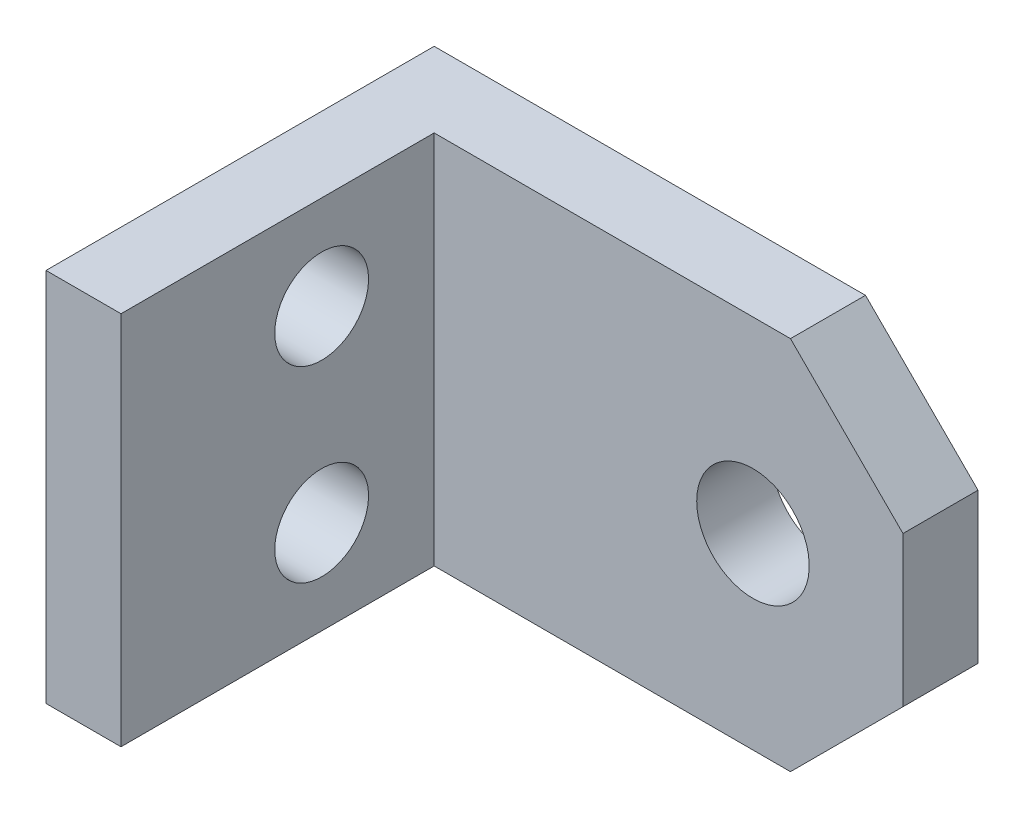
ISO-10303-21;
HEADER;
FILE_DESCRIPTION(('STEP AP214'),'2;1');
FILE_NAME('part.step','',(''),(''),'','','');
FILE_SCHEMA(('AUTOMOTIVE_DESIGN { 1 0 10303 214 1 1 1 1 }'));
ENDSEC;
DATA;
#1=APPLICATION_CONTEXT('core data for automotive mechanical design processes');
#2=APPLICATION_PROTOCOL_DEFINITION('international standard','automotive_design',2000,#1);
#3=PRODUCT_CONTEXT('',#1,'mechanical');
#4=PRODUCT('Part','Part','',(#3));
#5=PRODUCT_RELATED_PRODUCT_CATEGORY('part','',(#4));
#6=PRODUCT_DEFINITION_FORMATION('','',#4);
#7=PRODUCT_DEFINITION_CONTEXT('part definition',#1,'design');
#8=PRODUCT_DEFINITION('design','',#6,#7);
#9=PRODUCT_DEFINITION_SHAPE('','',#8);
#10=(LENGTH_UNIT() NAMED_UNIT(*) SI_UNIT(.MILLI.,.METRE.));
#11=(NAMED_UNIT(*) PLANE_ANGLE_UNIT() SI_UNIT($,.RADIAN.));
#12=(NAMED_UNIT(*) SI_UNIT($,.STERADIAN.) SOLID_ANGLE_UNIT());
#13=UNCERTAINTY_MEASURE_WITH_UNIT(LENGTH_MEASURE(1.E-05),#10,'distance_accuracy_value','');
#14=(GEOMETRIC_REPRESENTATION_CONTEXT(3) GLOBAL_UNCERTAINTY_ASSIGNED_CONTEXT((#13)) GLOBAL_UNIT_ASSIGNED_CONTEXT((#10,
#11,#12)) REPRESENTATION_CONTEXT('',''));
#15=CARTESIAN_POINT('',(0.,0.,0.));
#16=DIRECTION('',(0.,0.,1.));
#17=DIRECTION('',(1.,0.,0.));
#18=AXIS2_PLACEMENT_3D('',#15,#16,#17);
#19=CARTESIAN_POINT('',(4.,0.,0.));
#20=DIRECTION('',(-1.,0.,0.));
#21=DIRECTION('',(0.,0.,1.));
#22=AXIS2_PLACEMENT_3D('',#19,#20,#21);
#23=PLANE('',#22);
#24=CARTESIAN_POINT('',(4.,5.,-10.7));
#25=DIRECTION('',(-1.,0.,0.));
#26=DIRECTION('',(0.,0.,1.));
#27=AXIS2_PLACEMENT_3D('',#24,#25,#26);
#28=CIRCLE('',#27,2.5);
#29=CARTESIAN_POINT('',(4.,5.,-8.2));
#30=VERTEX_POINT('',#29);
#31=EDGE_CURVE('E314',#30,#30,#28,.T.);
#32=ORIENTED_EDGE('',*,*,#31,.T.);
#33=EDGE_LOOP('',(#32));
#34=FACE_BOUND('',#33,.T.);
#35=CARTESIAN_POINT('',(4.,15.,-10.7));
#36=DIRECTION('',(-1.,0.,0.));
#37=DIRECTION('',(0.,0.,1.));
#38=AXIS2_PLACEMENT_3D('',#35,#36,#37);
#39=CIRCLE('',#38,2.5);
#40=CARTESIAN_POINT('',(4.,15.,-8.2));
#41=VERTEX_POINT('',#40);
#42=EDGE_CURVE('E119',#41,#41,#39,.T.);
#43=ORIENTED_EDGE('',*,*,#42,.T.);
#44=EDGE_LOOP('',(#43));
#45=FACE_BOUND('',#44,.T.);
#46=DIRECTION('',(0.,-1.,0.));
#47=VECTOR('',#46,1.);
#48=CARTESIAN_POINT('',(4.,20.,-16.7));
#49=LINE('',#48,#47);
#50=CARTESIAN_POINT('',(4.,20.,-16.7));
#51=VERTEX_POINT('',#50);
#52=CARTESIAN_POINT('',(4.,0.,-16.7));
#53=VERTEX_POINT('',#52);
#54=EDGE_CURVE('E110',#51,#53,#49,.T.);
#55=ORIENTED_EDGE('',*,*,#54,.F.);
#56=DIRECTION('',(0.,0.,1.));
#57=VECTOR('',#56,1.);
#58=CARTESIAN_POINT('',(4.,20.,0.));
#59=LINE('',#58,#57);
#60=CARTESIAN_POINT('',(4.,20.,0.));
#61=VERTEX_POINT('',#60);
#62=EDGE_CURVE('E115',#51,#61,#59,.T.);
#63=ORIENTED_EDGE('',*,*,#62,.T.);
#64=DIRECTION('',(0.,-1.,0.));
#65=VECTOR('',#64,1.);
#66=CARTESIAN_POINT('',(4.,0.,0.));
#67=LINE('',#66,#65);
#68=CARTESIAN_POINT('',(4.,0.,0.));
#69=VERTEX_POINT('',#68);
#70=EDGE_CURVE('E113',#61,#69,#67,.T.);
#71=ORIENTED_EDGE('',*,*,#70,.T.);
#72=DIRECTION('',(0.,0.,-1.));
#73=VECTOR('',#72,1.);
#74=CARTESIAN_POINT('',(4.,0.,0.));
#75=LINE('',#74,#73);
#76=EDGE_CURVE('E101',#69,#53,#75,.T.);
#77=ORIENTED_EDGE('',*,*,#76,.T.);
#78=EDGE_LOOP('',(#55,#63,#71,#77));
#79=FACE_BOUND('',#78,.T.);
#80=ADVANCED_FACE('F35',(#34,#45,#79),#23,.F.);
#81=CARTESIAN_POINT('',(4.,0.,0.));
#82=DIRECTION('',(0.,0.,-1.));
#83=DIRECTION('',(-1.,0.,0.));
#84=AXIS2_PLACEMENT_3D('',#81,#82,#83);
#85=PLANE('',#84);
#86=DIRECTION('',(0.,-1.,0.));
#87=VECTOR('',#86,1.);
#88=CARTESIAN_POINT('',(0.,0.,0.));
#89=LINE('',#88,#87);
#90=CARTESIAN_POINT('',(0.,20.,0.));
#91=VERTEX_POINT('',#90);
#92=CARTESIAN_POINT('',(0.,0.,0.));
#93=VERTEX_POINT('',#92);
#94=EDGE_CURVE('E157',#91,#93,#89,.T.);
#95=ORIENTED_EDGE('',*,*,#94,.T.);
#96=DIRECTION('',(-1.,0.,0.));
#97=VECTOR('',#96,1.);
#98=CARTESIAN_POINT('',(4.,0.,0.));
#99=LINE('',#98,#97);
#100=EDGE_CURVE('E141',#69,#93,#99,.T.);
#101=ORIENTED_EDGE('',*,*,#100,.F.);
#102=ORIENTED_EDGE('',*,*,#70,.F.);
#103=DIRECTION('',(-1.,0.,0.));
#104=VECTOR('',#103,1.);
#105=CARTESIAN_POINT('',(4.,20.,0.));
#106=LINE('',#105,#104);
#107=EDGE_CURVE('E148',#61,#91,#106,.T.);
#108=ORIENTED_EDGE('',*,*,#107,.T.);
#109=EDGE_LOOP('',(#95,#101,#102,#108));
#110=FACE_BOUND('',#109,.T.);
#111=ADVANCED_FACE('F195',(#110),#85,.F.);
#112=CARTESIAN_POINT('',(4.,0.,0.));
#113=DIRECTION('',(0.,1.,0.));
#114=DIRECTION('',(0.,0.,1.));
#115=AXIS2_PLACEMENT_3D('',#112,#113,#114);
#116=PLANE('',#115);
#117=DIRECTION('',(-1.,0.,0.));
#118=VECTOR('',#117,1.);
#119=CARTESIAN_POINT('',(4.,0.,-20.7));
#120=LINE('',#119,#118);
#121=CARTESIAN_POINT('',(23.,0.,-20.7));
#122=VERTEX_POINT('',#121);
#123=CARTESIAN_POINT('',(0.,0.,-20.7));
#124=VERTEX_POINT('',#123);
#125=EDGE_CURVE('E144',#122,#124,#120,.T.);
#126=ORIENTED_EDGE('',*,*,#125,.F.);
#127=DIRECTION('',(0.,0.,1.));
#128=VECTOR('',#127,1.);
#129=CARTESIAN_POINT('',(23.,0.,0.));
#130=LINE('',#129,#128);
#131=CARTESIAN_POINT('',(23.,0.,-16.7));
#132=VERTEX_POINT('',#131);
#133=EDGE_CURVE('E58',#122,#132,#130,.T.);
#134=ORIENTED_EDGE('',*,*,#133,.T.);
#135=DIRECTION('',(-1.,0.,0.));
#136=VECTOR('',#135,1.);
#137=CARTESIAN_POINT('',(29.,0.,-16.7));
#138=LINE('',#137,#136);
#139=EDGE_CURVE('E97',#132,#53,#138,.T.);
#140=ORIENTED_EDGE('',*,*,#139,.T.);
#141=ORIENTED_EDGE('',*,*,#76,.F.);
#142=ORIENTED_EDGE('',*,*,#100,.T.);
#143=DIRECTION('',(0.,0.,-1.));
#144=VECTOR('',#143,1.);
#145=CARTESIAN_POINT('',(0.,0.,0.));
#146=LINE('',#145,#144);
#147=EDGE_CURVE('E155',#93,#124,#146,.T.);
#148=ORIENTED_EDGE('',*,*,#147,.T.);
#149=EDGE_LOOP('',(#126,#134,#140,#141,#142,#148));
#150=FACE_BOUND('',#149,.T.);
#151=ADVANCED_FACE('F99',(#150),#116,.F.);
#152=CARTESIAN_POINT('',(4.,0.,-20.7));
#153=DIRECTION('',(0.,0.,1.));
#154=DIRECTION('',(1.,0.,0.));
#155=AXIS2_PLACEMENT_3D('',#152,#153,#154);
#156=PLANE('',#155);
#157=CARTESIAN_POINT('',(21.,10.,-20.7));
#158=DIRECTION('',(0.,0.,-1.));
#159=DIRECTION('',(-1.,0.,0.));
#160=AXIS2_PLACEMENT_3D('',#157,#158,#159);
#161=CIRCLE('',#160,3.);
#162=CARTESIAN_POINT('',(18.,10.,-20.7));
#163=VERTEX_POINT('',#162);
#164=EDGE_CURVE('E322',#163,#163,#161,.T.);
#165=ORIENTED_EDGE('',*,*,#164,.F.);
#166=EDGE_LOOP('',(#165));
#167=FACE_BOUND('',#166,.T.);
#168=DIRECTION('',(0.,1.,0.));
#169=VECTOR('',#168,1.);
#170=CARTESIAN_POINT('',(29.,20.,-20.7));
#171=LINE('',#170,#169);
#172=CARTESIAN_POINT('',(29.,6.,-20.7));
#173=VERTEX_POINT('',#172);
#174=CARTESIAN_POINT('',(29.,14.,-20.7));
#175=VERTEX_POINT('',#174);
#176=EDGE_CURVE('E118',#173,#175,#171,.T.);
#177=ORIENTED_EDGE('',*,*,#176,.F.);
#178=DIRECTION('',(0.707106781186549,0.707106781186546,0.));
#179=VECTOR('',#178,1.);
#180=CARTESIAN_POINT('',(29.,6.00000000000001,-20.7));
#181=LINE('',#180,#179);
#182=EDGE_CURVE('E173',#173,#122,#181,.F.);
#183=ORIENTED_EDGE('',*,*,#182,.T.);
#184=ORIENTED_EDGE('',*,*,#125,.T.);
#185=DIRECTION('',(0.,1.,0.));
#186=VECTOR('',#185,1.);
#187=CARTESIAN_POINT('',(0.,0.,-20.7));
#188=LINE('',#187,#186);
#189=CARTESIAN_POINT('',(0.,20.,-20.7));
#190=VERTEX_POINT('',#189);
#191=EDGE_CURVE('E152',#124,#190,#188,.T.);
#192=ORIENTED_EDGE('',*,*,#191,.T.);
#193=DIRECTION('',(-1.,0.,0.));
#194=VECTOR('',#193,1.);
#195=CARTESIAN_POINT('',(4.,20.,-20.7));
#196=LINE('',#195,#194);
#197=CARTESIAN_POINT('',(23.,20.,-20.7));
#198=VERTEX_POINT('',#197);
#199=EDGE_CURVE('E146',#198,#190,#196,.T.);
#200=ORIENTED_EDGE('',*,*,#199,.F.);
#201=DIRECTION('',(-0.707106781186549,0.707106781186546,0.));
#202=VECTOR('',#201,1.);
#203=CARTESIAN_POINT('',(29.,14.,-20.7));
#204=LINE('',#203,#202);
#205=EDGE_CURVE('E171',#198,#175,#204,.F.);
#206=ORIENTED_EDGE('',*,*,#205,.T.);
#207=EDGE_LOOP('',(#177,#183,#184,#192,#200,#206));
#208=FACE_BOUND('',#207,.T.);
#209=ADVANCED_FACE('F213',(#167,#208),#156,.F.);
#210=CARTESIAN_POINT('',(4.,20.,0.));
#211=DIRECTION('',(0.,-1.,0.));
#212=DIRECTION('',(0.,0.,-1.));
#213=AXIS2_PLACEMENT_3D('',#210,#211,#212);
#214=PLANE('',#213);
#215=DIRECTION('',(-1.,0.,0.));
#216=VECTOR('',#215,1.);
#217=CARTESIAN_POINT('',(29.,20.,-16.7));
#218=LINE('',#217,#216);
#219=CARTESIAN_POINT('',(23.,20.,-16.7));
#220=VERTEX_POINT('',#219);
#221=EDGE_CURVE('E105',#220,#51,#218,.T.);
#222=ORIENTED_EDGE('',*,*,#221,.F.);
#223=DIRECTION('',(0.,0.,-1.));
#224=VECTOR('',#223,1.);
#225=CARTESIAN_POINT('',(23.,20.,0.));
#226=LINE('',#225,#224);
#227=EDGE_CURVE('E11',#220,#198,#226,.T.);
#228=ORIENTED_EDGE('',*,*,#227,.T.);
#229=ORIENTED_EDGE('',*,*,#199,.T.);
#230=DIRECTION('',(0.,0.,1.));
#231=VECTOR('',#230,1.);
#232=CARTESIAN_POINT('',(0.,20.,0.));
#233=LINE('',#232,#231);
#234=EDGE_CURVE('E136',#190,#91,#233,.T.);
#235=ORIENTED_EDGE('',*,*,#234,.T.);
#236=ORIENTED_EDGE('',*,*,#107,.F.);
#237=ORIENTED_EDGE('',*,*,#62,.F.);
#238=EDGE_LOOP('',(#222,#228,#229,#235,#236,#237));
#239=FACE_BOUND('',#238,.T.);
#240=ADVANCED_FACE('F209',(#239),#214,.F.);
#241=CARTESIAN_POINT('',(0.,0.,0.));
#242=DIRECTION('',(-1.,0.,0.));
#243=DIRECTION('',(0.,0.,1.));
#244=AXIS2_PLACEMENT_3D('',#241,#242,#243);
#245=PLANE('',#244);
#246=CARTESIAN_POINT('',(0.,5.,-10.7));
#247=DIRECTION('',(-1.,0.,0.));
#248=DIRECTION('',(0.,0.,1.));
#249=AXIS2_PLACEMENT_3D('',#246,#247,#248);
#250=CIRCLE('',#249,2.5);
#251=CARTESIAN_POINT('',(0.,5.,-8.2));
#252=VERTEX_POINT('',#251);
#253=EDGE_CURVE('E317',#252,#252,#250,.T.);
#254=ORIENTED_EDGE('',*,*,#253,.F.);
#255=EDGE_LOOP('',(#254));
#256=FACE_BOUND('',#255,.T.);
#257=CARTESIAN_POINT('',(0.,15.,-10.7));
#258=DIRECTION('',(-1.,0.,0.));
#259=DIRECTION('',(0.,0.,1.));
#260=AXIS2_PLACEMENT_3D('',#257,#258,#259);
#261=CIRCLE('',#260,2.5);
#262=CARTESIAN_POINT('',(0.,15.,-8.2));
#263=VERTEX_POINT('',#262);
#264=EDGE_CURVE('E124',#263,#263,#261,.T.);
#265=ORIENTED_EDGE('',*,*,#264,.F.);
#266=EDGE_LOOP('',(#265));
#267=FACE_BOUND('',#266,.T.);
#268=ORIENTED_EDGE('',*,*,#94,.F.);
#269=ORIENTED_EDGE('',*,*,#234,.F.);
#270=ORIENTED_EDGE('',*,*,#191,.F.);
#271=ORIENTED_EDGE('',*,*,#147,.F.);
#272=EDGE_LOOP('',(#268,#269,#270,#271));
#273=FACE_BOUND('',#272,.T.);
#274=ADVANCED_FACE('F206',(#256,#267,#273),#245,.T.);
#275=CARTESIAN_POINT('',(29.,20.,-16.7));
#276=DIRECTION('',(0.,0.,-1.));
#277=DIRECTION('',(0.,1.,0.));
#278=AXIS2_PLACEMENT_3D('',#275,#276,#277);
#279=PLANE('',#278);
#280=CARTESIAN_POINT('',(21.,10.,-16.7));
#281=DIRECTION('',(0.,0.,-1.));
#282=DIRECTION('',(-1.,0.,0.));
#283=AXIS2_PLACEMENT_3D('',#280,#281,#282);
#284=CIRCLE('',#283,3.);
#285=CARTESIAN_POINT('',(18.,10.,-16.7));
#286=VERTEX_POINT('',#285);
#287=EDGE_CURVE('E318',#286,#286,#284,.T.);
#288=ORIENTED_EDGE('',*,*,#287,.T.);
#289=EDGE_LOOP('',(#288));
#290=FACE_BOUND('',#289,.T.);
#291=ORIENTED_EDGE('',*,*,#139,.F.);
#292=DIRECTION('',(-0.707106781186549,-0.707106781186546,0.));
#293=VECTOR('',#292,1.);
#294=CARTESIAN_POINT('',(29.,6.00000000000001,-16.7));
#295=LINE('',#294,#293);
#296=CARTESIAN_POINT('',(29.,6.00000000000001,-16.7));
#297=VERTEX_POINT('',#296);
#298=EDGE_CURVE('E43',#132,#297,#295,.F.);
#299=ORIENTED_EDGE('',*,*,#298,.T.);
#300=DIRECTION('',(0.,-1.,0.));
#301=VECTOR('',#300,1.);
#302=CARTESIAN_POINT('',(29.,20.,-16.7));
#303=LINE('',#302,#301);
#304=CARTESIAN_POINT('',(29.,14.,-16.7));
#305=VERTEX_POINT('',#304);
#306=EDGE_CURVE('E106',#305,#297,#303,.T.);
#307=ORIENTED_EDGE('',*,*,#306,.F.);
#308=DIRECTION('',(0.707106781186549,-0.707106781186546,0.));
#309=VECTOR('',#308,1.);
#310=CARTESIAN_POINT('',(29.,14.,-16.7));
#311=LINE('',#310,#309);
#312=EDGE_CURVE('E50',#305,#220,#311,.F.);
#313=ORIENTED_EDGE('',*,*,#312,.T.);
#314=ORIENTED_EDGE('',*,*,#221,.T.);
#315=ORIENTED_EDGE('',*,*,#54,.T.);
#316=EDGE_LOOP('',(#291,#299,#307,#313,#314,#315));
#317=FACE_BOUND('',#316,.T.);
#318=ADVANCED_FACE('F117',(#290,#317),#279,.F.);
#319=CARTESIAN_POINT('',(29.,0.,0.));
#320=DIRECTION('',(-1.,0.,0.));
#321=DIRECTION('',(0.,0.,1.));
#322=AXIS2_PLACEMENT_3D('',#319,#320,#321);
#323=PLANE('',#322);
#324=ORIENTED_EDGE('',*,*,#306,.T.);
#325=DIRECTION('',(0.,0.,-1.));
#326=VECTOR('',#325,1.);
#327=CARTESIAN_POINT('',(29.,6.00000000000001,0.));
#328=LINE('',#327,#326);
#329=EDGE_CURVE('E168',#297,#173,#328,.T.);
#330=ORIENTED_EDGE('',*,*,#329,.T.);
#331=ORIENTED_EDGE('',*,*,#176,.T.);
#332=DIRECTION('',(0.,0.,1.));
#333=VECTOR('',#332,1.);
#334=CARTESIAN_POINT('',(29.,14.,0.));
#335=LINE('',#334,#333);
#336=EDGE_CURVE('E143',#175,#305,#335,.T.);
#337=ORIENTED_EDGE('',*,*,#336,.T.);
#338=EDGE_LOOP('',(#324,#330,#331,#337));
#339=FACE_BOUND('',#338,.T.);
#340=ADVANCED_FACE('F180',(#339),#323,.F.);
#341=CARTESIAN_POINT('',(4.,15.,-10.7));
#342=DIRECTION('',(-1.,0.,0.));
#343=DIRECTION('',(0.,0.,1.));
#344=AXIS2_PLACEMENT_3D('',#341,#342,#343);
#345=CYLINDRICAL_SURFACE('',#344,2.5);
#346=ORIENTED_EDGE('',*,*,#42,.F.);
#347=EDGE_LOOP('',(#346));
#348=FACE_BOUND('',#347,.T.);
#349=ORIENTED_EDGE('',*,*,#264,.T.);
#350=EDGE_LOOP('',(#349));
#351=FACE_BOUND('',#350,.T.);
#352=ADVANCED_FACE('F249',(#348,#351),#345,.F.);
#353=CARTESIAN_POINT('',(4.,5.,-10.7));
#354=DIRECTION('',(-1.,0.,0.));
#355=DIRECTION('',(0.,0.,1.));
#356=AXIS2_PLACEMENT_3D('',#353,#354,#355);
#357=CYLINDRICAL_SURFACE('',#356,2.5);
#358=ORIENTED_EDGE('',*,*,#31,.F.);
#359=EDGE_LOOP('',(#358));
#360=FACE_BOUND('',#359,.T.);
#361=ORIENTED_EDGE('',*,*,#253,.T.);
#362=EDGE_LOOP('',(#361));
#363=FACE_BOUND('',#362,.T.);
#364=ADVANCED_FACE('F190',(#360,#363),#357,.F.);
#365=CARTESIAN_POINT('',(21.,10.,-16.7));
#366=DIRECTION('',(0.,0.,-1.));
#367=DIRECTION('',(-1.,0.,0.));
#368=AXIS2_PLACEMENT_3D('',#365,#366,#367);
#369=CYLINDRICAL_SURFACE('',#368,3.);
#370=ORIENTED_EDGE('',*,*,#287,.F.);
#371=EDGE_LOOP('',(#370));
#372=FACE_BOUND('',#371,.T.);
#373=ORIENTED_EDGE('',*,*,#164,.T.);
#374=EDGE_LOOP('',(#373));
#375=FACE_BOUND('',#374,.T.);
#376=ADVANCED_FACE('F184',(#372,#375),#369,.F.);
#377=CARTESIAN_POINT('',(29.,6.00000000000001,0.));
#378=DIRECTION('',(-0.707106781186546,0.707106781186549,0.));
#379=DIRECTION('',(0.,0.,-1.));
#380=AXIS2_PLACEMENT_3D('',#377,#378,#379);
#381=PLANE('',#380);
#382=ORIENTED_EDGE('',*,*,#298,.F.);
#383=ORIENTED_EDGE('',*,*,#133,.F.);
#384=ORIENTED_EDGE('',*,*,#182,.F.);
#385=ORIENTED_EDGE('',*,*,#329,.F.);
#386=EDGE_LOOP('',(#382,#383,#384,#385));
#387=FACE_BOUND('',#386,.T.);
#388=ADVANCED_FACE('F182',(#387),#381,.F.);
#389=CARTESIAN_POINT('',(29.,14.,0.));
#390=DIRECTION('',(-0.707106781186546,-0.707106781186549,0.));
#391=DIRECTION('',(0.,0.,1.));
#392=AXIS2_PLACEMENT_3D('',#389,#390,#391);
#393=PLANE('',#392);
#394=ORIENTED_EDGE('',*,*,#205,.F.);
#395=ORIENTED_EDGE('',*,*,#227,.F.);
#396=ORIENTED_EDGE('',*,*,#312,.F.);
#397=ORIENTED_EDGE('',*,*,#336,.F.);
#398=EDGE_LOOP('',(#394,#395,#396,#397));
#399=FACE_BOUND('',#398,.T.);
#400=ADVANCED_FACE('F37',(#399),#393,.F.);
#401=CLOSED_SHELL('',(#80,#111,#151,#209,#240,#274,#318,#340,#352,#364,#376,#388,#400));
#402=MANIFOLD_SOLID_BREP('B2',#401);
#403=ADVANCED_BREP_SHAPE_REPRESENTATION('',(#18,#402),#14);
#404=SHAPE_DEFINITION_REPRESENTATION(#9,#403);
ENDSEC;
END-ISO-10303-21;
